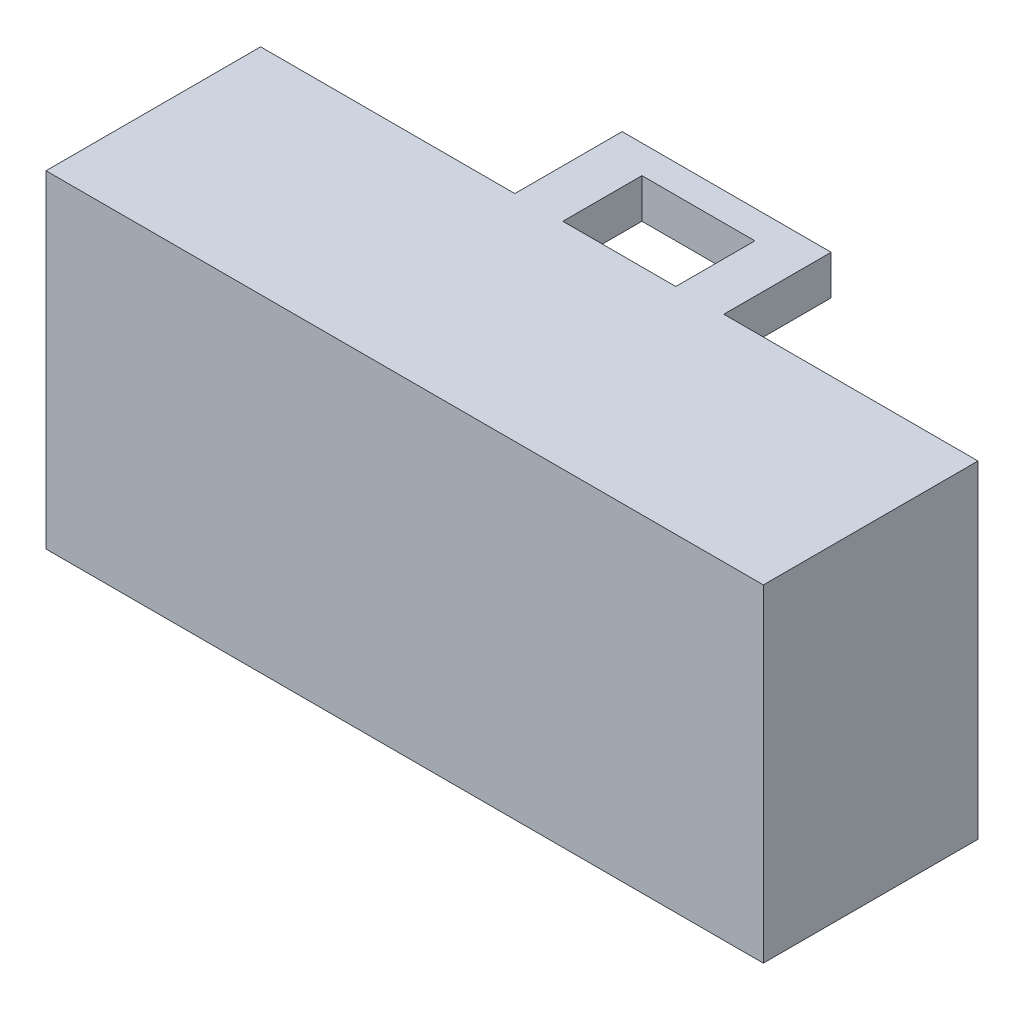
ISO-10303-21;
HEADER;
FILE_DESCRIPTION(('STEP AP214'),'2;1');
FILE_NAME('part.step','',(''),(''),'','','');
FILE_SCHEMA(('AUTOMOTIVE_DESIGN { 1 0 10303 214 1 1 1 1 }'));
ENDSEC;
DATA;
#1=APPLICATION_CONTEXT('core data for automotive mechanical design processes');
#2=APPLICATION_PROTOCOL_DEFINITION('international standard','automotive_design',2000,#1);
#3=PRODUCT_CONTEXT('',#1,'mechanical');
#4=PRODUCT('Part','Part','',(#3));
#5=PRODUCT_RELATED_PRODUCT_CATEGORY('part','',(#4));
#6=PRODUCT_DEFINITION_FORMATION('','',#4);
#7=PRODUCT_DEFINITION_CONTEXT('part definition',#1,'design');
#8=PRODUCT_DEFINITION('design','',#6,#7);
#9=PRODUCT_DEFINITION_SHAPE('','',#8);
#10=(LENGTH_UNIT() NAMED_UNIT(*) SI_UNIT(.MILLI.,.METRE.));
#11=(NAMED_UNIT(*) PLANE_ANGLE_UNIT() SI_UNIT($,.RADIAN.));
#12=(NAMED_UNIT(*) SI_UNIT($,.STERADIAN.) SOLID_ANGLE_UNIT());
#13=UNCERTAINTY_MEASURE_WITH_UNIT(LENGTH_MEASURE(1.E-05),#10,'distance_accuracy_value','');
#14=(GEOMETRIC_REPRESENTATION_CONTEXT(3) GLOBAL_UNCERTAINTY_ASSIGNED_CONTEXT((#13)) GLOBAL_UNIT_ASSIGNED_CONTEXT((#10,
#11,#12)) REPRESENTATION_CONTEXT('',''));
#15=CARTESIAN_POINT('',(0.,0.,0.));
#16=DIRECTION('',(0.,0.,1.));
#17=DIRECTION('',(1.,0.,0.));
#18=AXIS2_PLACEMENT_3D('',#15,#16,#17);
#19=CARTESIAN_POINT('',(0.,0.,0.));
#20=DIRECTION('',(0.,0.,-1.));
#21=DIRECTION('',(-1.,0.,0.));
#22=AXIS2_PLACEMENT_3D('',#19,#20,#21);
#23=PLANE('',#22);
#24=DIRECTION('',(-1.,0.,0.));
#25=VECTOR('',#24,1.);
#26=CARTESIAN_POINT('',(-1.85,-2.2,0.));
#27=LINE('',#26,#25);
#28=CARTESIAN_POINT('',(1.85,-2.2,0.));
#29=VERTEX_POINT('',#28);
#30=CARTESIAN_POINT('',(1.,-2.2,0.));
#31=VERTEX_POINT('',#30);
#32=EDGE_CURVE('E238',#29,#31,#27,.T.);
#33=ORIENTED_EDGE('',*,*,#32,.T.);
#34=DIRECTION('',(0.,1.,0.));
#35=VECTOR('',#34,1.);
#36=CARTESIAN_POINT('',(1.,-2.95,0.));
#37=LINE('',#36,#35);
#38=CARTESIAN_POINT('',(1.,-2.9,0.));
#39=VERTEX_POINT('',#38);
#40=EDGE_CURVE('E59',#39,#31,#37,.T.);
#41=ORIENTED_EDGE('',*,*,#40,.F.);
#42=DIRECTION('',(1.,0.,0.));
#43=VECTOR('',#42,1.);
#44=CARTESIAN_POINT('',(-6.35,-2.9,0.));
#45=LINE('',#44,#43);
#46=CARTESIAN_POINT('',(-1.,-2.9,0.));
#47=VERTEX_POINT('',#46);
#48=EDGE_CURVE('E170',#47,#39,#45,.T.);
#49=ORIENTED_EDGE('',*,*,#48,.F.);
#50=DIRECTION('',(0.,1.,0.));
#51=VECTOR('',#50,1.);
#52=CARTESIAN_POINT('',(-1.,-2.95,0.));
#53=LINE('',#52,#51);
#54=CARTESIAN_POINT('',(-1.,-2.2,0.));
#55=VERTEX_POINT('',#54);
#56=EDGE_CURVE('E172',#47,#55,#53,.T.);
#57=ORIENTED_EDGE('',*,*,#56,.T.);
#58=CARTESIAN_POINT('',(-1.85,-2.2,0.));
#59=VERTEX_POINT('',#58);
#60=EDGE_CURVE('E313',#55,#59,#27,.T.);
#61=ORIENTED_EDGE('',*,*,#60,.T.);
#62=DIRECTION('',(0.,-1.,0.));
#63=VECTOR('',#62,1.);
#64=CARTESIAN_POINT('',(-1.85,-2.9,0.));
#65=LINE('',#64,#63);
#66=CARTESIAN_POINT('',(-1.85,-2.9,0.));
#67=VERTEX_POINT('',#66);
#68=EDGE_CURVE('E227',#59,#67,#65,.T.);
#69=ORIENTED_EDGE('',*,*,#68,.T.);
#70=DIRECTION('',(1.,0.,0.));
#71=VECTOR('',#70,1.);
#72=CARTESIAN_POINT('',(-6.35,-2.9,0.));
#73=LINE('',#72,#71);
#74=CARTESIAN_POINT('',(-6.35,-2.9,0.));
#75=VERTEX_POINT('',#74);
#76=EDGE_CURVE('E333',#75,#67,#73,.T.);
#77=ORIENTED_EDGE('',*,*,#76,.F.);
#78=DIRECTION('',(0.,-1.,0.));
#79=VECTOR('',#78,1.);
#80=CARTESIAN_POINT('',(-6.35,-2.9,0.));
#81=LINE('',#80,#79);
#82=CARTESIAN_POINT('',(-6.35,2.9,0.));
#83=VERTEX_POINT('',#82);
#84=EDGE_CURVE('E334',#83,#75,#81,.T.);
#85=ORIENTED_EDGE('',*,*,#84,.F.);
#86=DIRECTION('',(-1.,0.,0.));
#87=VECTOR('',#86,1.);
#88=CARTESIAN_POINT('',(-6.35,2.9,0.));
#89=LINE('',#88,#87);
#90=CARTESIAN_POINT('',(-1.85,2.9,0.));
#91=VERTEX_POINT('',#90);
#92=EDGE_CURVE('E362',#91,#83,#89,.T.);
#93=ORIENTED_EDGE('',*,*,#92,.F.);
#94=DIRECTION('',(0.,-1.,0.));
#95=VECTOR('',#94,1.);
#96=CARTESIAN_POINT('',(-1.85,2.9,0.));
#97=LINE('',#96,#95);
#98=CARTESIAN_POINT('',(-1.85,2.2,0.));
#99=VERTEX_POINT('',#98);
#100=EDGE_CURVE('E219',#91,#99,#97,.T.);
#101=ORIENTED_EDGE('',*,*,#100,.T.);
#102=DIRECTION('',(1.,0.,0.));
#103=VECTOR('',#102,1.);
#104=CARTESIAN_POINT('',(-1.85,2.2,0.));
#105=LINE('',#104,#103);
#106=CARTESIAN_POINT('',(-1.,2.2,0.));
#107=VERTEX_POINT('',#106);
#108=EDGE_CURVE('E207',#99,#107,#105,.T.);
#109=ORIENTED_EDGE('',*,*,#108,.T.);
#110=CARTESIAN_POINT('',(-1.,2.9,0.));
#111=VERTEX_POINT('',#110);
#112=EDGE_CURVE('E52',#107,#111,#53,.T.);
#113=ORIENTED_EDGE('',*,*,#112,.T.);
#114=DIRECTION('',(-1.,0.,0.));
#115=VECTOR('',#114,1.);
#116=CARTESIAN_POINT('',(-6.35,2.9,0.));
#117=LINE('',#116,#115);
#118=CARTESIAN_POINT('',(1.,2.9,0.));
#119=VERTEX_POINT('',#118);
#120=EDGE_CURVE('E177',#119,#111,#117,.T.);
#121=ORIENTED_EDGE('',*,*,#120,.F.);
#122=CARTESIAN_POINT('',(1.,2.2,0.));
#123=VERTEX_POINT('',#122);
#124=EDGE_CURVE('E188',#123,#119,#37,.T.);
#125=ORIENTED_EDGE('',*,*,#124,.F.);
#126=CARTESIAN_POINT('',(1.85,2.2,0.));
#127=VERTEX_POINT('',#126);
#128=EDGE_CURVE('E222',#123,#127,#105,.T.);
#129=ORIENTED_EDGE('',*,*,#128,.T.);
#130=DIRECTION('',(0.,1.,0.));
#131=VECTOR('',#130,1.);
#132=CARTESIAN_POINT('',(1.85,2.2,0.));
#133=LINE('',#132,#131);
#134=CARTESIAN_POINT('',(1.85,2.9,0.));
#135=VERTEX_POINT('',#134);
#136=EDGE_CURVE('E197',#127,#135,#133,.T.);
#137=ORIENTED_EDGE('',*,*,#136,.T.);
#138=CARTESIAN_POINT('',(6.35,2.9,0.));
#139=VERTEX_POINT('',#138);
#140=EDGE_CURVE('E353',#139,#135,#89,.T.);
#141=ORIENTED_EDGE('',*,*,#140,.F.);
#142=DIRECTION('',(0.,1.,0.));
#143=VECTOR('',#142,1.);
#144=CARTESIAN_POINT('',(6.35,-2.9,0.));
#145=LINE('',#144,#143);
#146=CARTESIAN_POINT('',(6.35,-2.9,0.));
#147=VERTEX_POINT('',#146);
#148=EDGE_CURVE('E360',#147,#139,#145,.T.);
#149=ORIENTED_EDGE('',*,*,#148,.F.);
#150=CARTESIAN_POINT('',(1.85,-2.9,0.));
#151=VERTEX_POINT('',#150);
#152=EDGE_CURVE('E330',#151,#147,#73,.T.);
#153=ORIENTED_EDGE('',*,*,#152,.F.);
#154=DIRECTION('',(0.,1.,0.));
#155=VECTOR('',#154,1.);
#156=CARTESIAN_POINT('',(1.85,-2.2,0.));
#157=LINE('',#156,#155);
#158=EDGE_CURVE('E255',#151,#29,#157,.T.);
#159=ORIENTED_EDGE('',*,*,#158,.T.);
#160=EDGE_LOOP('',(#33,#41,#49,#57,#61,#69,#77,#85,#93,#101,#109,#113,#121,#125,#129,#137,#141,
#149,#153,#159));
#161=FACE_BOUND('',#160,.T.);
#162=ADVANCED_FACE('F37',(#161),#23,.T.);
#163=CARTESIAN_POINT('',(6.35,-2.9,3.8));
#164=DIRECTION('',(-1.,0.,0.));
#165=DIRECTION('',(0.,0.,1.));
#166=AXIS2_PLACEMENT_3D('',#163,#164,#165);
#167=PLANE('',#166);
#168=ORIENTED_EDGE('',*,*,#148,.T.);
#169=DIRECTION('',(0.,0.,-1.));
#170=VECTOR('',#169,1.);
#171=CARTESIAN_POINT('',(6.35,2.9,3.8));
#172=LINE('',#171,#170);
#173=CARTESIAN_POINT('',(6.35,2.9,3.8));
#174=VERTEX_POINT('',#173);
#175=EDGE_CURVE('E260',#174,#139,#172,.T.);
#176=ORIENTED_EDGE('',*,*,#175,.F.);
#177=DIRECTION('',(0.,1.,0.));
#178=VECTOR('',#177,1.);
#179=CARTESIAN_POINT('',(6.35,-2.9,3.8));
#180=LINE('',#179,#178);
#181=CARTESIAN_POINT('',(6.35,-2.9,3.8));
#182=VERTEX_POINT('',#181);
#183=EDGE_CURVE('E375',#182,#174,#180,.T.);
#184=ORIENTED_EDGE('',*,*,#183,.F.);
#185=DIRECTION('',(0.,0.,-1.));
#186=VECTOR('',#185,1.);
#187=CARTESIAN_POINT('',(6.35,-2.9,3.8));
#188=LINE('',#187,#186);
#189=EDGE_CURVE('E340',#182,#147,#188,.T.);
#190=ORIENTED_EDGE('',*,*,#189,.T.);
#191=EDGE_LOOP('',(#168,#176,#184,#190));
#192=FACE_BOUND('',#191,.T.);
#193=ADVANCED_FACE('F39',(#192),#167,.F.);
#194=CARTESIAN_POINT('',(-6.35,2.9,3.8));
#195=DIRECTION('',(0.,-1.,0.));
#196=DIRECTION('',(0.,0.,-1.));
#197=AXIS2_PLACEMENT_3D('',#194,#195,#196);
#198=PLANE('',#197);
#199=ORIENTED_EDGE('',*,*,#120,.T.);
#200=DIRECTION('',(0.,0.,-1.));
#201=VECTOR('',#200,1.);
#202=CARTESIAN_POINT('',(-0.999999999999999,2.9,3.8));
#203=LINE('',#202,#201);
#204=CARTESIAN_POINT('',(-1.,2.9,-1.4));
#205=VERTEX_POINT('',#204);
#206=EDGE_CURVE('E194',#111,#205,#203,.T.);
#207=ORIENTED_EDGE('',*,*,#206,.T.);
#208=DIRECTION('',(1.,0.,0.));
#209=VECTOR('',#208,1.);
#210=CARTESIAN_POINT('',(-6.35,2.9,-1.4));
#211=LINE('',#210,#209);
#212=CARTESIAN_POINT('',(1.,2.9,-1.4));
#213=VERTEX_POINT('',#212);
#214=EDGE_CURVE('E199',#205,#213,#211,.T.);
#215=ORIENTED_EDGE('',*,*,#214,.T.);
#216=DIRECTION('',(0.,0.,1.));
#217=VECTOR('',#216,1.);
#218=CARTESIAN_POINT('',(1.,2.9,3.8));
#219=LINE('',#218,#217);
#220=EDGE_CURVE('E279',#213,#119,#219,.T.);
#221=ORIENTED_EDGE('',*,*,#220,.T.);
#222=EDGE_LOOP('',(#199,#207,#215,#221));
#223=FACE_BOUND('',#222,.T.);
#224=ORIENTED_EDGE('',*,*,#140,.T.);
#225=DIRECTION('',(0.,0.,1.));
#226=VECTOR('',#225,1.);
#227=CARTESIAN_POINT('',(1.85,2.9,-1.9));
#228=LINE('',#227,#226);
#229=CARTESIAN_POINT('',(1.85,2.9,-1.9));
#230=VERTEX_POINT('',#229);
#231=EDGE_CURVE('E216',#230,#135,#228,.T.);
#232=ORIENTED_EDGE('',*,*,#231,.F.);
#233=DIRECTION('',(-1.,0.,0.));
#234=VECTOR('',#233,1.);
#235=CARTESIAN_POINT('',(1.85,2.9,-1.9));
#236=LINE('',#235,#234);
#237=CARTESIAN_POINT('',(-1.85,2.9,-1.9));
#238=VERTEX_POINT('',#237);
#239=EDGE_CURVE('E206',#230,#238,#236,.T.);
#240=ORIENTED_EDGE('',*,*,#239,.T.);
#241=DIRECTION('',(0.,0.,1.));
#242=VECTOR('',#241,1.);
#243=CARTESIAN_POINT('',(-1.85,2.9,-1.9));
#244=LINE('',#243,#242);
#245=EDGE_CURVE('E230',#238,#91,#244,.T.);
#246=ORIENTED_EDGE('',*,*,#245,.T.);
#247=ORIENTED_EDGE('',*,*,#92,.T.);
#248=DIRECTION('',(0.,0.,-1.));
#249=VECTOR('',#248,1.);
#250=CARTESIAN_POINT('',(-6.35,2.9,3.8));
#251=LINE('',#250,#249);
#252=CARTESIAN_POINT('',(-6.35,2.9,3.8));
#253=VERTEX_POINT('',#252);
#254=EDGE_CURVE('E348',#253,#83,#251,.T.);
#255=ORIENTED_EDGE('',*,*,#254,.F.);
#256=DIRECTION('',(-1.,0.,0.));
#257=VECTOR('',#256,1.);
#258=CARTESIAN_POINT('',(-6.35,2.9,3.8));
#259=LINE('',#258,#257);
#260=EDGE_CURVE('E355',#174,#253,#259,.T.);
#261=ORIENTED_EDGE('',*,*,#260,.F.);
#262=ORIENTED_EDGE('',*,*,#175,.T.);
#263=EDGE_LOOP('',(#224,#232,#240,#246,#247,#255,#261,#262));
#264=FACE_BOUND('',#263,.T.);
#265=ADVANCED_FACE('F298',(#223,#264),#198,.F.);
#266=CARTESIAN_POINT('',(-6.35,-2.9,3.8));
#267=DIRECTION('',(1.,0.,0.));
#268=DIRECTION('',(0.,0.,-1.));
#269=AXIS2_PLACEMENT_3D('',#266,#267,#268);
#270=PLANE('',#269);
#271=ORIENTED_EDGE('',*,*,#84,.T.);
#272=DIRECTION('',(0.,0.,-1.));
#273=VECTOR('',#272,1.);
#274=CARTESIAN_POINT('',(-6.35,-2.9,3.8));
#275=LINE('',#274,#273);
#276=CARTESIAN_POINT('',(-6.35,-2.9,3.8));
#277=VERTEX_POINT('',#276);
#278=EDGE_CURVE('E344',#277,#75,#275,.T.);
#279=ORIENTED_EDGE('',*,*,#278,.F.);
#280=DIRECTION('',(0.,-1.,0.));
#281=VECTOR('',#280,1.);
#282=CARTESIAN_POINT('',(-6.35,-2.9,3.8));
#283=LINE('',#282,#281);
#284=EDGE_CURVE('E378',#253,#277,#283,.T.);
#285=ORIENTED_EDGE('',*,*,#284,.F.);
#286=ORIENTED_EDGE('',*,*,#254,.T.);
#287=EDGE_LOOP('',(#271,#279,#285,#286));
#288=FACE_BOUND('',#287,.T.);
#289=ADVANCED_FACE('F369',(#288),#270,.F.);
#290=CARTESIAN_POINT('',(-6.35,-2.9,3.8));
#291=DIRECTION('',(0.,1.,0.));
#292=DIRECTION('',(0.,0.,1.));
#293=AXIS2_PLACEMENT_3D('',#290,#291,#292);
#294=PLANE('',#293);
#295=DIRECTION('',(-1.,0.,0.));
#296=VECTOR('',#295,1.);
#297=CARTESIAN_POINT('',(-6.35,-2.9,-1.4));
#298=LINE('',#297,#296);
#299=CARTESIAN_POINT('',(1.,-2.9,-1.4));
#300=VERTEX_POINT('',#299);
#301=CARTESIAN_POINT('',(-1.,-2.9,-1.4));
#302=VERTEX_POINT('',#301);
#303=EDGE_CURVE('E193',#300,#302,#298,.T.);
#304=ORIENTED_EDGE('',*,*,#303,.T.);
#305=DIRECTION('',(0.,0.,1.));
#306=VECTOR('',#305,1.);
#307=CARTESIAN_POINT('',(-0.999999999999999,-2.9,3.8));
#308=LINE('',#307,#306);
#309=EDGE_CURVE('E183',#302,#47,#308,.T.);
#310=ORIENTED_EDGE('',*,*,#309,.T.);
#311=ORIENTED_EDGE('',*,*,#48,.T.);
#312=DIRECTION('',(0.,0.,-1.));
#313=VECTOR('',#312,1.);
#314=CARTESIAN_POINT('',(1.,-2.9,3.8));
#315=LINE('',#314,#313);
#316=EDGE_CURVE('E292',#39,#300,#315,.T.);
#317=ORIENTED_EDGE('',*,*,#316,.T.);
#318=EDGE_LOOP('',(#304,#310,#311,#317));
#319=FACE_BOUND('',#318,.T.);
#320=ORIENTED_EDGE('',*,*,#76,.T.);
#321=DIRECTION('',(0.,0.,1.));
#322=VECTOR('',#321,1.);
#323=CARTESIAN_POINT('',(-1.85,-2.9,-1.9));
#324=LINE('',#323,#322);
#325=CARTESIAN_POINT('',(-1.85,-2.9,-1.9));
#326=VERTEX_POINT('',#325);
#327=EDGE_CURVE('E247',#326,#67,#324,.T.);
#328=ORIENTED_EDGE('',*,*,#327,.F.);
#329=DIRECTION('',(1.,0.,0.));
#330=VECTOR('',#329,1.);
#331=CARTESIAN_POINT('',(1.85,-2.9,-1.9));
#332=LINE('',#331,#330);
#333=CARTESIAN_POINT('',(1.85,-2.9,-1.9));
#334=VERTEX_POINT('',#333);
#335=EDGE_CURVE('E237',#326,#334,#332,.T.);
#336=ORIENTED_EDGE('',*,*,#335,.T.);
#337=DIRECTION('',(0.,0.,1.));
#338=VECTOR('',#337,1.);
#339=CARTESIAN_POINT('',(1.85,-2.9,-1.9));
#340=LINE('',#339,#338);
#341=EDGE_CURVE('E325',#334,#151,#340,.T.);
#342=ORIENTED_EDGE('',*,*,#341,.T.);
#343=ORIENTED_EDGE('',*,*,#152,.T.);
#344=ORIENTED_EDGE('',*,*,#189,.F.);
#345=DIRECTION('',(1.,0.,0.));
#346=VECTOR('',#345,1.);
#347=CARTESIAN_POINT('',(-6.35,-2.9,3.8));
#348=LINE('',#347,#346);
#349=EDGE_CURVE('E345',#277,#182,#348,.T.);
#350=ORIENTED_EDGE('',*,*,#349,.F.);
#351=ORIENTED_EDGE('',*,*,#278,.T.);
#352=EDGE_LOOP('',(#320,#328,#336,#342,#343,#344,#350,#351));
#353=FACE_BOUND('',#352,.T.);
#354=ADVANCED_FACE('F191',(#319,#353),#294,.F.);
#355=CARTESIAN_POINT('',(0.,0.,3.8));
#356=DIRECTION('',(0.,0.,-1.));
#357=DIRECTION('',(-1.,0.,0.));
#358=AXIS2_PLACEMENT_3D('',#355,#356,#357);
#359=PLANE('',#358);
#360=ORIENTED_EDGE('',*,*,#183,.T.);
#361=ORIENTED_EDGE('',*,*,#260,.T.);
#362=ORIENTED_EDGE('',*,*,#284,.T.);
#363=ORIENTED_EDGE('',*,*,#349,.T.);
#364=EDGE_LOOP('',(#360,#361,#362,#363));
#365=FACE_BOUND('',#364,.T.);
#366=ADVANCED_FACE('F380',(#365),#359,.F.);
#367=CARTESIAN_POINT('',(-1.85,-2.9,-1.9));
#368=DIRECTION('',(-1.,0.,0.));
#369=DIRECTION('',(0.,0.,1.));
#370=AXIS2_PLACEMENT_3D('',#367,#368,#369);
#371=PLANE('',#370);
#372=ORIENTED_EDGE('',*,*,#68,.F.);
#373=DIRECTION('',(0.,0.,1.));
#374=VECTOR('',#373,1.);
#375=CARTESIAN_POINT('',(-1.85,-2.2,-1.9));
#376=LINE('',#375,#374);
#377=CARTESIAN_POINT('',(-1.85,-2.2,-1.9));
#378=VERTEX_POINT('',#377);
#379=EDGE_CURVE('E314',#378,#59,#376,.T.);
#380=ORIENTED_EDGE('',*,*,#379,.F.);
#381=DIRECTION('',(0.,-1.,0.));
#382=VECTOR('',#381,1.);
#383=CARTESIAN_POINT('',(-1.85,-2.9,-1.9));
#384=LINE('',#383,#382);
#385=EDGE_CURVE('E234',#378,#326,#384,.T.);
#386=ORIENTED_EDGE('',*,*,#385,.T.);
#387=ORIENTED_EDGE('',*,*,#327,.T.);
#388=EDGE_LOOP('',(#372,#380,#386,#387));
#389=FACE_BOUND('',#388,.T.);
#390=ADVANCED_FACE('F382',(#389),#371,.T.);
#391=CARTESIAN_POINT('',(-1.85,-2.2,-1.9));
#392=DIRECTION('',(0.,1.,0.));
#393=DIRECTION('',(0.,0.,1.));
#394=AXIS2_PLACEMENT_3D('',#391,#392,#393);
#395=PLANE('',#394);
#396=DIRECTION('',(0.,0.,1.));
#397=VECTOR('',#396,1.);
#398=CARTESIAN_POINT('',(-1.,-2.2,-1.9));
#399=LINE('',#398,#397);
#400=CARTESIAN_POINT('',(-1.,-2.2,-1.4));
#401=VERTEX_POINT('',#400);
#402=EDGE_CURVE('E186',#401,#55,#399,.T.);
#403=ORIENTED_EDGE('',*,*,#402,.F.);
#404=DIRECTION('',(-1.,0.,0.));
#405=VECTOR('',#404,1.);
#406=CARTESIAN_POINT('',(-1.85,-2.2,-1.4));
#407=LINE('',#406,#405);
#408=CARTESIAN_POINT('',(1.,-2.2,-1.4));
#409=VERTEX_POINT('',#408);
#410=EDGE_CURVE('E295',#409,#401,#407,.T.);
#411=ORIENTED_EDGE('',*,*,#410,.F.);
#412=DIRECTION('',(0.,0.,-1.));
#413=VECTOR('',#412,1.);
#414=CARTESIAN_POINT('',(1.,-2.2,-1.9));
#415=LINE('',#414,#413);
#416=EDGE_CURVE('E290',#31,#409,#415,.T.);
#417=ORIENTED_EDGE('',*,*,#416,.F.);
#418=ORIENTED_EDGE('',*,*,#32,.F.);
#419=DIRECTION('',(0.,0.,1.));
#420=VECTOR('',#419,1.);
#421=CARTESIAN_POINT('',(1.85,-2.2,-1.9));
#422=LINE('',#421,#420);
#423=CARTESIAN_POINT('',(1.85,-2.2,-1.9));
#424=VERTEX_POINT('',#423);
#425=EDGE_CURVE('E327',#424,#29,#422,.T.);
#426=ORIENTED_EDGE('',*,*,#425,.F.);
#427=DIRECTION('',(-1.,0.,0.));
#428=VECTOR('',#427,1.);
#429=CARTESIAN_POINT('',(-1.85,-2.2,-1.9));
#430=LINE('',#429,#428);
#431=EDGE_CURVE('E244',#424,#378,#430,.T.);
#432=ORIENTED_EDGE('',*,*,#431,.T.);
#433=ORIENTED_EDGE('',*,*,#379,.T.);
#434=ORIENTED_EDGE('',*,*,#60,.F.);
#435=EDGE_LOOP('',(#403,#411,#417,#418,#426,#432,#433,#434));
#436=FACE_BOUND('',#435,.T.);
#437=ADVANCED_FACE('F310',(#436),#395,.T.);
#438=CARTESIAN_POINT('',(1.85,-2.2,-1.9));
#439=DIRECTION('',(1.,0.,0.));
#440=DIRECTION('',(0.,1.,0.));
#441=AXIS2_PLACEMENT_3D('',#438,#439,#440);
#442=PLANE('',#441);
#443=ORIENTED_EDGE('',*,*,#158,.F.);
#444=ORIENTED_EDGE('',*,*,#341,.F.);
#445=DIRECTION('',(0.,1.,0.));
#446=VECTOR('',#445,1.);
#447=CARTESIAN_POINT('',(1.85,-2.2,-1.9));
#448=LINE('',#447,#446);
#449=EDGE_CURVE('E241',#334,#424,#448,.T.);
#450=ORIENTED_EDGE('',*,*,#449,.T.);
#451=ORIENTED_EDGE('',*,*,#425,.T.);
#452=EDGE_LOOP('',(#443,#444,#450,#451));
#453=FACE_BOUND('',#452,.T.);
#454=ADVANCED_FACE('F421',(#453),#442,.T.);
#455=CARTESIAN_POINT('',(0.,0.,-1.9));
#456=DIRECTION('',(0.,0.,-1.));
#457=DIRECTION('',(-1.,0.,0.));
#458=AXIS2_PLACEMENT_3D('',#455,#456,#457);
#459=PLANE('',#458);
#460=ORIENTED_EDGE('',*,*,#385,.F.);
#461=ORIENTED_EDGE('',*,*,#431,.F.);
#462=ORIENTED_EDGE('',*,*,#449,.F.);
#463=ORIENTED_EDGE('',*,*,#335,.F.);
#464=EDGE_LOOP('',(#460,#461,#462,#463));
#465=FACE_BOUND('',#464,.T.);
#466=ADVANCED_FACE('F496',(#465),#459,.T.);
#467=CARTESIAN_POINT('',(1.85,2.2,-1.9));
#468=DIRECTION('',(1.,0.,0.));
#469=DIRECTION('',(0.,1.,0.));
#470=AXIS2_PLACEMENT_3D('',#467,#468,#469);
#471=PLANE('',#470);
#472=ORIENTED_EDGE('',*,*,#136,.F.);
#473=DIRECTION('',(0.,0.,1.));
#474=VECTOR('',#473,1.);
#475=CARTESIAN_POINT('',(1.85,2.2,-1.9));
#476=LINE('',#475,#474);
#477=CARTESIAN_POINT('',(1.85,2.2,-1.9));
#478=VERTEX_POINT('',#477);
#479=EDGE_CURVE('E224',#478,#127,#476,.T.);
#480=ORIENTED_EDGE('',*,*,#479,.F.);
#481=DIRECTION('',(0.,1.,0.));
#482=VECTOR('',#481,1.);
#483=CARTESIAN_POINT('',(1.85,2.2,-1.9));
#484=LINE('',#483,#482);
#485=EDGE_CURVE('E203',#478,#230,#484,.T.);
#486=ORIENTED_EDGE('',*,*,#485,.T.);
#487=ORIENTED_EDGE('',*,*,#231,.T.);
#488=EDGE_LOOP('',(#472,#480,#486,#487));
#489=FACE_BOUND('',#488,.T.);
#490=ADVANCED_FACE('F433',(#489),#471,.T.);
#491=CARTESIAN_POINT('',(-1.85,2.2,-1.9));
#492=DIRECTION('',(0.,-1.,0.));
#493=DIRECTION('',(0.,0.,-1.));
#494=AXIS2_PLACEMENT_3D('',#491,#492,#493);
#495=PLANE('',#494);
#496=DIRECTION('',(0.,0.,-1.));
#497=VECTOR('',#496,1.);
#498=CARTESIAN_POINT('',(-1.,2.2,-1.9));
#499=LINE('',#498,#497);
#500=CARTESIAN_POINT('',(-1.,2.2,-1.4));
#501=VERTEX_POINT('',#500);
#502=EDGE_CURVE('E11',#107,#501,#499,.T.);
#503=ORIENTED_EDGE('',*,*,#502,.F.);
#504=ORIENTED_EDGE('',*,*,#108,.F.);
#505=DIRECTION('',(0.,0.,1.));
#506=VECTOR('',#505,1.);
#507=CARTESIAN_POINT('',(-1.85,2.2,-1.9));
#508=LINE('',#507,#506);
#509=CARTESIAN_POINT('',(-1.85,2.2,-1.9));
#510=VERTEX_POINT('',#509);
#511=EDGE_CURVE('E228',#510,#99,#508,.T.);
#512=ORIENTED_EDGE('',*,*,#511,.F.);
#513=DIRECTION('',(1.,0.,0.));
#514=VECTOR('',#513,1.);
#515=CARTESIAN_POINT('',(-1.85,2.2,-1.9));
#516=LINE('',#515,#514);
#517=EDGE_CURVE('E213',#510,#478,#516,.T.);
#518=ORIENTED_EDGE('',*,*,#517,.T.);
#519=ORIENTED_EDGE('',*,*,#479,.T.);
#520=ORIENTED_EDGE('',*,*,#128,.F.);
#521=DIRECTION('',(0.,0.,1.));
#522=VECTOR('',#521,1.);
#523=CARTESIAN_POINT('',(1.,2.2,-1.9));
#524=LINE('',#523,#522);
#525=CARTESIAN_POINT('',(1.,2.2,-1.4));
#526=VERTEX_POINT('',#525);
#527=EDGE_CURVE('E258',#526,#123,#524,.T.);
#528=ORIENTED_EDGE('',*,*,#527,.F.);
#529=DIRECTION('',(1.,0.,0.));
#530=VECTOR('',#529,1.);
#531=CARTESIAN_POINT('',(-1.85,2.2,-1.4));
#532=LINE('',#531,#530);
#533=EDGE_CURVE('E45',#501,#526,#532,.T.);
#534=ORIENTED_EDGE('',*,*,#533,.F.);
#535=EDGE_LOOP('',(#503,#504,#512,#518,#519,#520,#528,#534));
#536=FACE_BOUND('',#535,.T.);
#537=ADVANCED_FACE('F282',(#536),#495,.T.);
#538=CARTESIAN_POINT('',(-1.85,2.9,-1.9));
#539=DIRECTION('',(-1.,0.,0.));
#540=DIRECTION('',(0.,0.,1.));
#541=AXIS2_PLACEMENT_3D('',#538,#539,#540);
#542=PLANE('',#541);
#543=ORIENTED_EDGE('',*,*,#100,.F.);
#544=ORIENTED_EDGE('',*,*,#245,.F.);
#545=DIRECTION('',(0.,-1.,0.));
#546=VECTOR('',#545,1.);
#547=CARTESIAN_POINT('',(-1.85,2.9,-1.9));
#548=LINE('',#547,#546);
#549=EDGE_CURVE('E210',#238,#510,#548,.T.);
#550=ORIENTED_EDGE('',*,*,#549,.T.);
#551=ORIENTED_EDGE('',*,*,#511,.T.);
#552=EDGE_LOOP('',(#543,#544,#550,#551));
#553=FACE_BOUND('',#552,.T.);
#554=ADVANCED_FACE('F432',(#553),#542,.T.);
#555=CARTESIAN_POINT('',(0.,0.,-1.9));
#556=DIRECTION('',(0.,0.,1.));
#557=DIRECTION('',(1.,0.,0.));
#558=AXIS2_PLACEMENT_3D('',#555,#556,#557);
#559=PLANE('',#558);
#560=ORIENTED_EDGE('',*,*,#485,.F.);
#561=ORIENTED_EDGE('',*,*,#517,.F.);
#562=ORIENTED_EDGE('',*,*,#549,.F.);
#563=ORIENTED_EDGE('',*,*,#239,.F.);
#564=EDGE_LOOP('',(#560,#561,#562,#563));
#565=FACE_BOUND('',#564,.T.);
#566=ADVANCED_FACE('F446',(#565),#559,.F.);
#567=CARTESIAN_POINT('',(1.,-2.95,-1.4));
#568=DIRECTION('',(1.,0.,0.));
#569=DIRECTION('',(0.,0.,-1.));
#570=AXIS2_PLACEMENT_3D('',#567,#568,#569);
#571=PLANE('',#570);
#572=DIRECTION('',(0.,1.,0.));
#573=VECTOR('',#572,1.);
#574=CARTESIAN_POINT('',(1.,-2.95,-1.4));
#575=LINE('',#574,#573);
#576=EDGE_CURVE('E267',#526,#213,#575,.T.);
#577=ORIENTED_EDGE('',*,*,#576,.F.);
#578=ORIENTED_EDGE('',*,*,#527,.T.);
#579=ORIENTED_EDGE('',*,*,#124,.T.);
#580=ORIENTED_EDGE('',*,*,#220,.F.);
#581=EDGE_LOOP('',(#577,#578,#579,#580));
#582=FACE_BOUND('',#581,.T.);
#583=ADVANCED_FACE('F275',(#582),#571,.F.);
#584=CARTESIAN_POINT('',(1.,-2.95,-1.4));
#585=DIRECTION('',(0.,0.,-1.));
#586=DIRECTION('',(-1.,0.,0.));
#587=AXIS2_PLACEMENT_3D('',#584,#585,#586);
#588=PLANE('',#587);
#589=DIRECTION('',(0.,1.,0.));
#590=VECTOR('',#589,1.);
#591=CARTESIAN_POINT('',(-1.,-2.95,-1.4));
#592=LINE('',#591,#590);
#593=EDGE_CURVE('E270',#501,#205,#592,.T.);
#594=ORIENTED_EDGE('',*,*,#593,.F.);
#595=ORIENTED_EDGE('',*,*,#533,.T.);
#596=ORIENTED_EDGE('',*,*,#576,.T.);
#597=ORIENTED_EDGE('',*,*,#214,.F.);
#598=EDGE_LOOP('',(#594,#595,#596,#597));
#599=FACE_BOUND('',#598,.T.);
#600=ADVANCED_FACE('F266',(#599),#588,.F.);
#601=CARTESIAN_POINT('',(-1.,-2.95,-1.4));
#602=DIRECTION('',(-1.,0.,0.));
#603=DIRECTION('',(0.,0.,1.));
#604=AXIS2_PLACEMENT_3D('',#601,#602,#603);
#605=PLANE('',#604);
#606=ORIENTED_EDGE('',*,*,#112,.F.);
#607=ORIENTED_EDGE('',*,*,#502,.T.);
#608=ORIENTED_EDGE('',*,*,#593,.T.);
#609=ORIENTED_EDGE('',*,*,#206,.F.);
#610=EDGE_LOOP('',(#606,#607,#608,#609));
#611=FACE_BOUND('',#610,.T.);
#612=ADVANCED_FACE('F301',(#611),#605,.F.);
#613=EDGE_CURVE('E178',#302,#401,#592,.T.);
#614=ORIENTED_EDGE('',*,*,#613,.T.);
#615=ORIENTED_EDGE('',*,*,#402,.T.);
#616=ORIENTED_EDGE('',*,*,#56,.F.);
#617=ORIENTED_EDGE('',*,*,#309,.F.);
#618=EDGE_LOOP('',(#614,#615,#616,#617));
#619=FACE_BOUND('',#618,.T.);
#620=ADVANCED_FACE('F182',(#619),#605,.F.);
#621=EDGE_CURVE('E280',#300,#409,#575,.T.);
#622=ORIENTED_EDGE('',*,*,#621,.T.);
#623=ORIENTED_EDGE('',*,*,#410,.T.);
#624=ORIENTED_EDGE('',*,*,#613,.F.);
#625=ORIENTED_EDGE('',*,*,#303,.F.);
#626=EDGE_LOOP('',(#622,#623,#624,#625));
#627=FACE_BOUND('',#626,.T.);
#628=ADVANCED_FACE('F306',(#627),#588,.F.);
#629=ORIENTED_EDGE('',*,*,#40,.T.);
#630=ORIENTED_EDGE('',*,*,#416,.T.);
#631=ORIENTED_EDGE('',*,*,#621,.F.);
#632=ORIENTED_EDGE('',*,*,#316,.F.);
#633=EDGE_LOOP('',(#629,#630,#631,#632));
#634=FACE_BOUND('',#633,.T.);
#635=ADVANCED_FACE('F448',(#634),#571,.F.);
#636=CLOSED_SHELL('',(#162,#193,#265,#289,#354,#366,#390,#437,#454,#466,#490,#537,#554,#566,
#583,#600,#612,#620,#628,#635));
#637=MANIFOLD_SOLID_BREP('B2',#636);
#638=ADVANCED_BREP_SHAPE_REPRESENTATION('',(#18,#637),#14);
#639=SHAPE_DEFINITION_REPRESENTATION(#9,#638);
ENDSEC;
END-ISO-10303-21;
